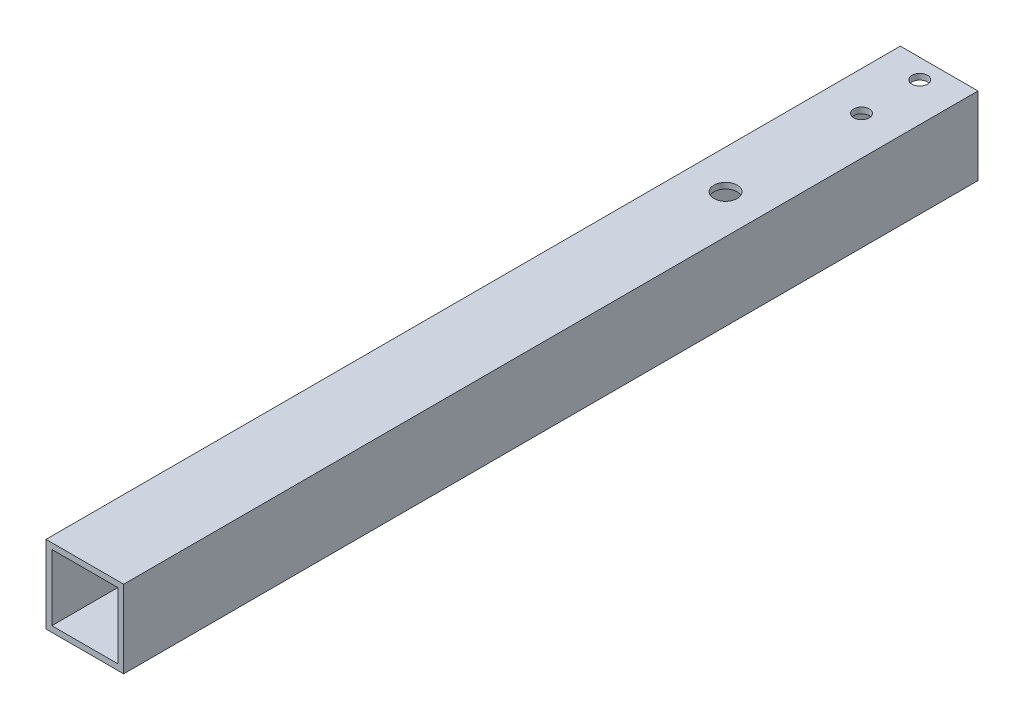
ISO-10303-21;
HEADER;
FILE_DESCRIPTION(('STEP AP214'),'2;1');
FILE_NAME('part.step','',(''),(''),'','','');
FILE_SCHEMA(('AUTOMOTIVE_DESIGN { 1 0 10303 214 1 1 1 1 }'));
ENDSEC;
DATA;
#1=APPLICATION_CONTEXT('core data for automotive mechanical design processes');
#2=APPLICATION_PROTOCOL_DEFINITION('international standard','automotive_design',2000,#1);
#3=PRODUCT_CONTEXT('',#1,'mechanical');
#4=PRODUCT('Part','Part','',(#3));
#5=PRODUCT_RELATED_PRODUCT_CATEGORY('part','',(#4));
#6=PRODUCT_DEFINITION_FORMATION('','',#4);
#7=PRODUCT_DEFINITION_CONTEXT('part definition',#1,'design');
#8=PRODUCT_DEFINITION('design','',#6,#7);
#9=PRODUCT_DEFINITION_SHAPE('','',#8);
#10=(LENGTH_UNIT() NAMED_UNIT(*) SI_UNIT(.MILLI.,.METRE.));
#11=(NAMED_UNIT(*) PLANE_ANGLE_UNIT() SI_UNIT($,.RADIAN.));
#12=(NAMED_UNIT(*) SI_UNIT($,.STERADIAN.) SOLID_ANGLE_UNIT());
#13=UNCERTAINTY_MEASURE_WITH_UNIT(LENGTH_MEASURE(1.E-05),#10,'distance_accuracy_value','');
#14=(GEOMETRIC_REPRESENTATION_CONTEXT(3) GLOBAL_UNCERTAINTY_ASSIGNED_CONTEXT((#13)) GLOBAL_UNIT_ASSIGNED_CONTEXT((#10,
#11,#12)) REPRESENTATION_CONTEXT('',''));
#15=CARTESIAN_POINT('',(0.,0.,0.));
#16=DIRECTION('',(0.,0.,1.));
#17=DIRECTION('',(1.,0.,0.));
#18=AXIS2_PLACEMENT_3D('',#15,#16,#17);
#19=CARTESIAN_POINT('',(0.,0.,220.));
#20=DIRECTION('',(0.,0.,1.));
#21=DIRECTION('',(1.,0.,0.));
#22=AXIS2_PLACEMENT_3D('',#19,#20,#21);
#23=PLANE('',#22);
#24=DIRECTION('',(0.,1.,0.));
#25=VECTOR('',#24,1.);
#26=CARTESIAN_POINT('',(10.,10.,220.));
#27=LINE('',#26,#25);
#28=CARTESIAN_POINT('',(10.,-10.,220.));
#29=VERTEX_POINT('',#28);
#30=CARTESIAN_POINT('',(10.,10.,220.));
#31=VERTEX_POINT('',#30);
#32=EDGE_CURVE('E150',#29,#31,#27,.T.);
#33=ORIENTED_EDGE('',*,*,#32,.T.);
#34=DIRECTION('',(-1.,0.,0.));
#35=VECTOR('',#34,1.);
#36=CARTESIAN_POINT('',(-10.,10.,220.));
#37=LINE('',#36,#35);
#38=CARTESIAN_POINT('',(-10.,10.,220.));
#39=VERTEX_POINT('',#38);
#40=EDGE_CURVE('E153',#31,#39,#37,.T.);
#41=ORIENTED_EDGE('',*,*,#40,.T.);
#42=DIRECTION('',(0.,-1.,0.));
#43=VECTOR('',#42,1.);
#44=CARTESIAN_POINT('',(-10.,10.,220.));
#45=LINE('',#44,#43);
#46=CARTESIAN_POINT('',(-10.,-10.,220.));
#47=VERTEX_POINT('',#46);
#48=EDGE_CURVE('E156',#39,#47,#45,.T.);
#49=ORIENTED_EDGE('',*,*,#48,.T.);
#50=DIRECTION('',(1.,0.,0.));
#51=VECTOR('',#50,1.);
#52=CARTESIAN_POINT('',(-10.,-10.,220.));
#53=LINE('',#52,#51);
#54=EDGE_CURVE('E158',#47,#29,#53,.T.);
#55=ORIENTED_EDGE('',*,*,#54,.T.);
#56=EDGE_LOOP('',(#33,#41,#49,#55));
#57=FACE_BOUND('',#56,.T.);
#58=DIRECTION('',(-1.,0.,0.));
#59=VECTOR('',#58,1.);
#60=CARTESIAN_POINT('',(-8.5,8.5,220.));
#61=LINE('',#60,#59);
#62=CARTESIAN_POINT('',(8.5,8.5,220.));
#63=VERTEX_POINT('',#62);
#64=CARTESIAN_POINT('',(-8.5,8.5,220.));
#65=VERTEX_POINT('',#64);
#66=EDGE_CURVE('E120',#63,#65,#61,.T.);
#67=ORIENTED_EDGE('',*,*,#66,.F.);
#68=DIRECTION('',(0.,1.,0.));
#69=VECTOR('',#68,1.);
#70=CARTESIAN_POINT('',(8.5,8.5,220.));
#71=LINE('',#70,#69);
#72=CARTESIAN_POINT('',(8.5,-8.5,220.));
#73=VERTEX_POINT('',#72);
#74=EDGE_CURVE('E112',#73,#63,#71,.T.);
#75=ORIENTED_EDGE('',*,*,#74,.F.);
#76=DIRECTION('',(1.,0.,0.));
#77=VECTOR('',#76,1.);
#78=CARTESIAN_POINT('',(-8.5,-8.5,220.));
#79=LINE('',#78,#77);
#80=CARTESIAN_POINT('',(-8.5,-8.5,220.));
#81=VERTEX_POINT('',#80);
#82=EDGE_CURVE('E134',#81,#73,#79,.T.);
#83=ORIENTED_EDGE('',*,*,#82,.F.);
#84=DIRECTION('',(0.,-1.,0.));
#85=VECTOR('',#84,1.);
#86=CARTESIAN_POINT('',(-8.5,8.5,220.));
#87=LINE('',#86,#85);
#88=EDGE_CURVE('E132',#65,#81,#87,.T.);
#89=ORIENTED_EDGE('',*,*,#88,.F.);
#90=EDGE_LOOP('',(#67,#75,#83,#89));
#91=FACE_BOUND('',#90,.T.);
#92=ADVANCED_FACE('F45',(#57,#91),#23,.T.);
#93=CARTESIAN_POINT('',(0.,0.,0.));
#94=DIRECTION('',(0.,0.,1.));
#95=DIRECTION('',(1.,0.,0.));
#96=AXIS2_PLACEMENT_3D('',#93,#94,#95);
#97=PLANE('',#96);
#98=DIRECTION('',(0.,1.,0.));
#99=VECTOR('',#98,1.);
#100=CARTESIAN_POINT('',(10.,10.,0.));
#101=LINE('',#100,#99);
#102=CARTESIAN_POINT('',(10.,-10.,0.));
#103=VERTEX_POINT('',#102);
#104=CARTESIAN_POINT('',(10.,10.,0.));
#105=VERTEX_POINT('',#104);
#106=EDGE_CURVE('E128',#103,#105,#101,.T.);
#107=ORIENTED_EDGE('',*,*,#106,.F.);
#108=DIRECTION('',(1.,0.,0.));
#109=VECTOR('',#108,1.);
#110=CARTESIAN_POINT('',(-10.,-10.,0.));
#111=LINE('',#110,#109);
#112=CARTESIAN_POINT('',(-10.,-10.,0.));
#113=VERTEX_POINT('',#112);
#114=EDGE_CURVE('E154',#113,#103,#111,.T.);
#115=ORIENTED_EDGE('',*,*,#114,.F.);
#116=DIRECTION('',(0.,-1.,0.));
#117=VECTOR('',#116,1.);
#118=CARTESIAN_POINT('',(-10.,10.,0.));
#119=LINE('',#118,#117);
#120=CARTESIAN_POINT('',(-10.,10.,0.));
#121=VERTEX_POINT('',#120);
#122=EDGE_CURVE('E165',#121,#113,#119,.T.);
#123=ORIENTED_EDGE('',*,*,#122,.F.);
#124=DIRECTION('',(-1.,0.,0.));
#125=VECTOR('',#124,1.);
#126=CARTESIAN_POINT('',(-10.,10.,0.));
#127=LINE('',#126,#125);
#128=EDGE_CURVE('E163',#105,#121,#127,.T.);
#129=ORIENTED_EDGE('',*,*,#128,.F.);
#130=EDGE_LOOP('',(#107,#115,#123,#129));
#131=FACE_BOUND('',#130,.T.);
#132=DIRECTION('',(0.,1.,0.));
#133=VECTOR('',#132,1.);
#134=CARTESIAN_POINT('',(8.5,8.5,0.));
#135=LINE('',#134,#133);
#136=CARTESIAN_POINT('',(8.5,-8.5,0.));
#137=VERTEX_POINT('',#136);
#138=CARTESIAN_POINT('',(8.5,8.5,0.));
#139=VERTEX_POINT('',#138);
#140=EDGE_CURVE('E70',#137,#139,#135,.T.);
#141=ORIENTED_EDGE('',*,*,#140,.T.);
#142=DIRECTION('',(-1.,0.,0.));
#143=VECTOR('',#142,1.);
#144=CARTESIAN_POINT('',(-8.5,8.5,0.));
#145=LINE('',#144,#143);
#146=CARTESIAN_POINT('',(-8.5,8.5,0.));
#147=VERTEX_POINT('',#146);
#148=EDGE_CURVE('E127',#139,#147,#145,.T.);
#149=ORIENTED_EDGE('',*,*,#148,.T.);
#150=DIRECTION('',(0.,-1.,0.));
#151=VECTOR('',#150,1.);
#152=CARTESIAN_POINT('',(-8.5,8.5,0.));
#153=LINE('',#152,#151);
#154=CARTESIAN_POINT('',(-8.5,-8.5,0.));
#155=VERTEX_POINT('',#154);
#156=EDGE_CURVE('E142',#147,#155,#153,.T.);
#157=ORIENTED_EDGE('',*,*,#156,.T.);
#158=DIRECTION('',(1.,0.,0.));
#159=VECTOR('',#158,1.);
#160=CARTESIAN_POINT('',(-8.5,-8.5,0.));
#161=LINE('',#160,#159);
#162=EDGE_CURVE('E121',#155,#137,#161,.T.);
#163=ORIENTED_EDGE('',*,*,#162,.T.);
#164=EDGE_LOOP('',(#141,#149,#157,#163));
#165=FACE_BOUND('',#164,.T.);
#166=ADVANCED_FACE('F224',(#131,#165),#97,.F.);
#167=CARTESIAN_POINT('',(10.,10.,220.));
#168=DIRECTION('',(-1.,0.,0.));
#169=DIRECTION('',(0.,0.,1.));
#170=AXIS2_PLACEMENT_3D('',#167,#168,#169);
#171=PLANE('',#170);
#172=ORIENTED_EDGE('',*,*,#106,.T.);
#173=DIRECTION('',(0.,0.,-1.));
#174=VECTOR('',#173,1.);
#175=CARTESIAN_POINT('',(10.,10.,220.));
#176=LINE('',#175,#174);
#177=EDGE_CURVE('E13',#31,#105,#176,.T.);
#178=ORIENTED_EDGE('',*,*,#177,.F.);
#179=ORIENTED_EDGE('',*,*,#32,.F.);
#180=DIRECTION('',(0.,0.,-1.));
#181=VECTOR('',#180,1.);
#182=CARTESIAN_POINT('',(10.,-10.,220.));
#183=LINE('',#182,#181);
#184=EDGE_CURVE('E160',#29,#103,#183,.T.);
#185=ORIENTED_EDGE('',*,*,#184,.T.);
#186=EDGE_LOOP('',(#172,#178,#179,#185));
#187=FACE_BOUND('',#186,.T.);
#188=ADVANCED_FACE('F47',(#187),#171,.F.);
#189=CARTESIAN_POINT('',(-10.,10.,220.));
#190=DIRECTION('',(0.,-1.,0.));
#191=DIRECTION('',(0.,0.,-1.));
#192=AXIS2_PLACEMENT_3D('',#189,#190,#191);
#193=PLANE('',#192);
#194=CARTESIAN_POINT('',(0.,10.,55.));
#195=DIRECTION('',(0.,1.,0.));
#196=DIRECTION('',(0.,0.,1.));
#197=AXIS2_PLACEMENT_3D('',#194,#195,#196);
#198=CIRCLE('',#197,3.);
#199=CARTESIAN_POINT('',(0.,10.,58.));
#200=VERTEX_POINT('',#199);
#201=EDGE_CURVE('E251',#200,#200,#198,.T.);
#202=ORIENTED_EDGE('',*,*,#201,.F.);
#203=EDGE_LOOP('',(#202));
#204=FACE_BOUND('',#203,.T.);
#205=CARTESIAN_POINT('',(0.,10.,5.));
#206=DIRECTION('',(0.,-1.,0.));
#207=DIRECTION('',(0.,0.,-1.));
#208=AXIS2_PLACEMENT_3D('',#205,#206,#207);
#209=CIRCLE('',#208,2.);
#210=CARTESIAN_POINT('',(0.,10.,3.));
#211=VERTEX_POINT('',#210);
#212=EDGE_CURVE('E186',#211,#211,#209,.T.);
#213=ORIENTED_EDGE('',*,*,#212,.T.);
#214=EDGE_LOOP('',(#213));
#215=FACE_BOUND('',#214,.T.);
#216=CARTESIAN_POINT('',(0.,10.,20.));
#217=DIRECTION('',(0.,-1.,0.));
#218=DIRECTION('',(0.,0.,-1.));
#219=AXIS2_PLACEMENT_3D('',#216,#217,#218);
#220=CIRCLE('',#219,2.);
#221=CARTESIAN_POINT('',(0.,10.,18.));
#222=VERTEX_POINT('',#221);
#223=EDGE_CURVE('E140',#222,#222,#220,.T.);
#224=ORIENTED_EDGE('',*,*,#223,.T.);
#225=EDGE_LOOP('',(#224));
#226=FACE_BOUND('',#225,.T.);
#227=ORIENTED_EDGE('',*,*,#128,.T.);
#228=DIRECTION('',(0.,0.,-1.));
#229=VECTOR('',#228,1.);
#230=CARTESIAN_POINT('',(-10.,10.,220.));
#231=LINE('',#230,#229);
#232=EDGE_CURVE('E54',#39,#121,#231,.T.);
#233=ORIENTED_EDGE('',*,*,#232,.F.);
#234=ORIENTED_EDGE('',*,*,#40,.F.);
#235=ORIENTED_EDGE('',*,*,#177,.T.);
#236=EDGE_LOOP('',(#227,#233,#234,#235));
#237=FACE_BOUND('',#236,.T.);
#238=ADVANCED_FACE('F205',(#204,#215,#226,#237),#193,.F.);
#239=CARTESIAN_POINT('',(-10.,10.,220.));
#240=DIRECTION('',(1.,0.,0.));
#241=DIRECTION('',(0.,0.,-1.));
#242=AXIS2_PLACEMENT_3D('',#239,#240,#241);
#243=PLANE('',#242);
#244=ORIENTED_EDGE('',*,*,#122,.T.);
#245=DIRECTION('',(0.,0.,-1.));
#246=VECTOR('',#245,1.);
#247=CARTESIAN_POINT('',(-10.,-10.,220.));
#248=LINE('',#247,#246);
#249=EDGE_CURVE('E170',#47,#113,#248,.T.);
#250=ORIENTED_EDGE('',*,*,#249,.F.);
#251=ORIENTED_EDGE('',*,*,#48,.F.);
#252=ORIENTED_EDGE('',*,*,#232,.T.);
#253=EDGE_LOOP('',(#244,#250,#251,#252));
#254=FACE_BOUND('',#253,.T.);
#255=ADVANCED_FACE('F238',(#254),#243,.F.);
#256=CARTESIAN_POINT('',(-10.,-10.,220.));
#257=DIRECTION('',(0.,1.,0.));
#258=DIRECTION('',(0.,0.,1.));
#259=AXIS2_PLACEMENT_3D('',#256,#257,#258);
#260=PLANE('',#259);
#261=CARTESIAN_POINT('',(0.,-10.,55.));
#262=DIRECTION('',(0.,1.,0.));
#263=DIRECTION('',(0.,0.,1.));
#264=AXIS2_PLACEMENT_3D('',#261,#262,#263);
#265=CIRCLE('',#264,3.);
#266=CARTESIAN_POINT('',(0.,-10.,58.));
#267=VERTEX_POINT('',#266);
#268=EDGE_CURVE('E302',#267,#267,#265,.T.);
#269=ORIENTED_EDGE('',*,*,#268,.T.);
#270=EDGE_LOOP('',(#269));
#271=FACE_BOUND('',#270,.T.);
#272=CARTESIAN_POINT('',(0.,-10.,5.));
#273=DIRECTION('',(0.,-1.,0.));
#274=DIRECTION('',(0.,0.,-1.));
#275=AXIS2_PLACEMENT_3D('',#272,#273,#274);
#276=CIRCLE('',#275,2.);
#277=CARTESIAN_POINT('',(0.,-10.,3.));
#278=VERTEX_POINT('',#277);
#279=EDGE_CURVE('E182',#278,#278,#276,.T.);
#280=ORIENTED_EDGE('',*,*,#279,.F.);
#281=EDGE_LOOP('',(#280));
#282=FACE_BOUND('',#281,.T.);
#283=CARTESIAN_POINT('',(0.,-10.,20.));
#284=DIRECTION('',(0.,-1.,0.));
#285=DIRECTION('',(0.,0.,-1.));
#286=AXIS2_PLACEMENT_3D('',#283,#284,#285);
#287=CIRCLE('',#286,2.);
#288=CARTESIAN_POINT('',(0.,-10.,18.));
#289=VERTEX_POINT('',#288);
#290=EDGE_CURVE('E178',#289,#289,#287,.T.);
#291=ORIENTED_EDGE('',*,*,#290,.F.);
#292=EDGE_LOOP('',(#291));
#293=FACE_BOUND('',#292,.T.);
#294=ORIENTED_EDGE('',*,*,#114,.T.);
#295=ORIENTED_EDGE('',*,*,#184,.F.);
#296=ORIENTED_EDGE('',*,*,#54,.F.);
#297=ORIENTED_EDGE('',*,*,#249,.T.);
#298=EDGE_LOOP('',(#294,#295,#296,#297));
#299=FACE_BOUND('',#298,.T.);
#300=ADVANCED_FACE('F235',(#271,#282,#293,#299),#260,.F.);
#301=CARTESIAN_POINT('',(8.5,8.5,220.));
#302=DIRECTION('',(-1.,0.,0.));
#303=DIRECTION('',(0.,0.,1.));
#304=AXIS2_PLACEMENT_3D('',#301,#302,#303);
#305=PLANE('',#304);
#306=ORIENTED_EDGE('',*,*,#140,.F.);
#307=DIRECTION('',(0.,0.,-1.));
#308=VECTOR('',#307,1.);
#309=CARTESIAN_POINT('',(8.5,-8.5,220.));
#310=LINE('',#309,#308);
#311=EDGE_CURVE('E116',#73,#137,#310,.T.);
#312=ORIENTED_EDGE('',*,*,#311,.F.);
#313=ORIENTED_EDGE('',*,*,#74,.T.);
#314=DIRECTION('',(0.,0.,-1.));
#315=VECTOR('',#314,1.);
#316=CARTESIAN_POINT('',(8.5,8.5,220.));
#317=LINE('',#316,#315);
#318=EDGE_CURVE('E115',#63,#139,#317,.T.);
#319=ORIENTED_EDGE('',*,*,#318,.T.);
#320=EDGE_LOOP('',(#306,#312,#313,#319));
#321=FACE_BOUND('',#320,.T.);
#322=ADVANCED_FACE('F114',(#321),#305,.T.);
#323=CARTESIAN_POINT('',(-8.5,8.5,220.));
#324=DIRECTION('',(0.,-1.,0.));
#325=DIRECTION('',(0.,0.,-1.));
#326=AXIS2_PLACEMENT_3D('',#323,#324,#325);
#327=PLANE('',#326);
#328=CARTESIAN_POINT('',(0.,8.5,55.));
#329=DIRECTION('',(0.,-1.,0.));
#330=DIRECTION('',(0.,0.,-1.));
#331=AXIS2_PLACEMENT_3D('',#328,#329,#330);
#332=CIRCLE('',#331,3.);
#333=CARTESIAN_POINT('',(0.,8.5,52.));
#334=VERTEX_POINT('',#333);
#335=EDGE_CURVE('E189',#334,#334,#332,.T.);
#336=ORIENTED_EDGE('',*,*,#335,.F.);
#337=EDGE_LOOP('',(#336));
#338=FACE_BOUND('',#337,.T.);
#339=CARTESIAN_POINT('',(0.,8.5,5.));
#340=DIRECTION('',(0.,-1.,0.));
#341=DIRECTION('',(0.,0.,-1.));
#342=AXIS2_PLACEMENT_3D('',#339,#340,#341);
#343=CIRCLE('',#342,2.);
#344=CARTESIAN_POINT('',(0.,8.5,3.));
#345=VERTEX_POINT('',#344);
#346=EDGE_CURVE('E181',#345,#345,#343,.T.);
#347=ORIENTED_EDGE('',*,*,#346,.F.);
#348=EDGE_LOOP('',(#347));
#349=FACE_BOUND('',#348,.T.);
#350=CARTESIAN_POINT('',(0.,8.5,20.));
#351=DIRECTION('',(0.,-1.,0.));
#352=DIRECTION('',(0.,0.,-1.));
#353=AXIS2_PLACEMENT_3D('',#350,#351,#352);
#354=CIRCLE('',#353,2.);
#355=CARTESIAN_POINT('',(0.,8.5,18.));
#356=VERTEX_POINT('',#355);
#357=EDGE_CURVE('E177',#356,#356,#354,.T.);
#358=ORIENTED_EDGE('',*,*,#357,.F.);
#359=EDGE_LOOP('',(#358));
#360=FACE_BOUND('',#359,.T.);
#361=ORIENTED_EDGE('',*,*,#148,.F.);
#362=ORIENTED_EDGE('',*,*,#318,.F.);
#363=ORIENTED_EDGE('',*,*,#66,.T.);
#364=DIRECTION('',(0.,0.,-1.));
#365=VECTOR('',#364,1.);
#366=CARTESIAN_POINT('',(-8.5,8.5,220.));
#367=LINE('',#366,#365);
#368=EDGE_CURVE('E129',#65,#147,#367,.T.);
#369=ORIENTED_EDGE('',*,*,#368,.T.);
#370=EDGE_LOOP('',(#361,#362,#363,#369));
#371=FACE_BOUND('',#370,.T.);
#372=ADVANCED_FACE('F124',(#338,#349,#360,#371),#327,.T.);
#373=CARTESIAN_POINT('',(-8.5,8.5,220.));
#374=DIRECTION('',(1.,0.,0.));
#375=DIRECTION('',(0.,0.,-1.));
#376=AXIS2_PLACEMENT_3D('',#373,#374,#375);
#377=PLANE('',#376);
#378=ORIENTED_EDGE('',*,*,#156,.F.);
#379=ORIENTED_EDGE('',*,*,#368,.F.);
#380=ORIENTED_EDGE('',*,*,#88,.T.);
#381=DIRECTION('',(0.,0.,-1.));
#382=VECTOR('',#381,1.);
#383=CARTESIAN_POINT('',(-8.5,-8.5,220.));
#384=LINE('',#383,#382);
#385=EDGE_CURVE('E62',#81,#155,#384,.T.);
#386=ORIENTED_EDGE('',*,*,#385,.T.);
#387=EDGE_LOOP('',(#378,#379,#380,#386));
#388=FACE_BOUND('',#387,.T.);
#389=ADVANCED_FACE('F267',(#388),#377,.T.);
#390=CARTESIAN_POINT('',(-8.5,-8.5,220.));
#391=DIRECTION('',(0.,1.,0.));
#392=DIRECTION('',(0.,0.,1.));
#393=AXIS2_PLACEMENT_3D('',#390,#391,#392);
#394=PLANE('',#393);
#395=CARTESIAN_POINT('',(0.,-8.5,55.));
#396=DIRECTION('',(0.,1.,0.));
#397=DIRECTION('',(0.,0.,1.));
#398=AXIS2_PLACEMENT_3D('',#395,#396,#397);
#399=CIRCLE('',#398,3.);
#400=CARTESIAN_POINT('',(0.,-8.5,58.));
#401=VERTEX_POINT('',#400);
#402=EDGE_CURVE('E49',#401,#401,#399,.T.);
#403=ORIENTED_EDGE('',*,*,#402,.F.);
#404=EDGE_LOOP('',(#403));
#405=FACE_BOUND('',#404,.T.);
#406=CARTESIAN_POINT('',(0.,-8.5,5.));
#407=DIRECTION('',(0.,1.,0.));
#408=DIRECTION('',(0.,0.,1.));
#409=AXIS2_PLACEMENT_3D('',#406,#407,#408);
#410=CIRCLE('',#409,2.);
#411=CARTESIAN_POINT('',(0.,-8.5,7.));
#412=VERTEX_POINT('',#411);
#413=EDGE_CURVE('E179',#412,#412,#410,.T.);
#414=ORIENTED_EDGE('',*,*,#413,.F.);
#415=EDGE_LOOP('',(#414));
#416=FACE_BOUND('',#415,.T.);
#417=CARTESIAN_POINT('',(0.,-8.5,20.));
#418=DIRECTION('',(0.,1.,0.));
#419=DIRECTION('',(0.,0.,1.));
#420=AXIS2_PLACEMENT_3D('',#417,#418,#419);
#421=CIRCLE('',#420,2.);
#422=CARTESIAN_POINT('',(0.,-8.5,22.));
#423=VERTEX_POINT('',#422);
#424=EDGE_CURVE('E175',#423,#423,#421,.T.);
#425=ORIENTED_EDGE('',*,*,#424,.F.);
#426=EDGE_LOOP('',(#425));
#427=FACE_BOUND('',#426,.T.);
#428=ORIENTED_EDGE('',*,*,#162,.F.);
#429=ORIENTED_EDGE('',*,*,#385,.F.);
#430=ORIENTED_EDGE('',*,*,#82,.T.);
#431=ORIENTED_EDGE('',*,*,#311,.T.);
#432=EDGE_LOOP('',(#428,#429,#430,#431));
#433=FACE_BOUND('',#432,.T.);
#434=ADVANCED_FACE('F220',(#405,#416,#427,#433),#394,.T.);
#435=CARTESIAN_POINT('',(0.,13.,20.));
#436=DIRECTION('',(0.,-1.,0.));
#437=DIRECTION('',(0.,0.,-1.));
#438=AXIS2_PLACEMENT_3D('',#435,#436,#437);
#439=CYLINDRICAL_SURFACE('',#438,2.);
#440=ORIENTED_EDGE('',*,*,#424,.T.);
#441=EDGE_LOOP('',(#440));
#442=FACE_BOUND('',#441,.T.);
#443=ORIENTED_EDGE('',*,*,#290,.T.);
#444=EDGE_LOOP('',(#443));
#445=FACE_BOUND('',#444,.T.);
#446=ADVANCED_FACE('F211',(#442,#445),#439,.F.);
#447=ORIENTED_EDGE('',*,*,#357,.T.);
#448=EDGE_LOOP('',(#447));
#449=FACE_BOUND('',#448,.T.);
#450=ORIENTED_EDGE('',*,*,#223,.F.);
#451=EDGE_LOOP('',(#450));
#452=FACE_BOUND('',#451,.T.);
#453=ADVANCED_FACE('F208',(#449,#452),#439,.F.);
#454=CARTESIAN_POINT('',(0.,13.,5.));
#455=DIRECTION('',(0.,-1.,0.));
#456=DIRECTION('',(0.,0.,-1.));
#457=AXIS2_PLACEMENT_3D('',#454,#455,#456);
#458=CYLINDRICAL_SURFACE('',#457,2.);
#459=ORIENTED_EDGE('',*,*,#413,.T.);
#460=EDGE_LOOP('',(#459));
#461=FACE_BOUND('',#460,.T.);
#462=ORIENTED_EDGE('',*,*,#279,.T.);
#463=EDGE_LOOP('',(#462));
#464=FACE_BOUND('',#463,.T.);
#465=ADVANCED_FACE('F210',(#461,#464),#458,.F.);
#466=ORIENTED_EDGE('',*,*,#346,.T.);
#467=EDGE_LOOP('',(#466));
#468=FACE_BOUND('',#467,.T.);
#469=ORIENTED_EDGE('',*,*,#212,.F.);
#470=EDGE_LOOP('',(#469));
#471=FACE_BOUND('',#470,.T.);
#472=ADVANCED_FACE('F218',(#468,#471),#458,.F.);
#473=CARTESIAN_POINT('',(0.,-10.,55.));
#474=DIRECTION('',(0.,1.,0.));
#475=DIRECTION('',(0.,0.,1.));
#476=AXIS2_PLACEMENT_3D('',#473,#474,#475);
#477=CYLINDRICAL_SURFACE('',#476,3.);
#478=ORIENTED_EDGE('',*,*,#402,.T.);
#479=EDGE_LOOP('',(#478));
#480=FACE_BOUND('',#479,.T.);
#481=ORIENTED_EDGE('',*,*,#268,.F.);
#482=EDGE_LOOP('',(#481));
#483=FACE_BOUND('',#482,.T.);
#484=ADVANCED_FACE('F255',(#480,#483),#477,.F.);
#485=ORIENTED_EDGE('',*,*,#335,.T.);
#486=EDGE_LOOP('',(#485));
#487=FACE_BOUND('',#486,.T.);
#488=ORIENTED_EDGE('',*,*,#201,.T.);
#489=EDGE_LOOP('',(#488));
#490=FACE_BOUND('',#489,.T.);
#491=ADVANCED_FACE('F260',(#487,#490),#477,.F.);
#492=CLOSED_SHELL('',(#92,#166,#188,#238,#255,#300,#322,#372,#389,#434,#446,#453,#465,#472,#484,#491));
#493=MANIFOLD_SOLID_BREP('B2',#492);
#494=ADVANCED_BREP_SHAPE_REPRESENTATION('',(#18,#493),#14);
#495=SHAPE_DEFINITION_REPRESENTATION(#9,#494);
ENDSEC;
END-ISO-10303-21;
